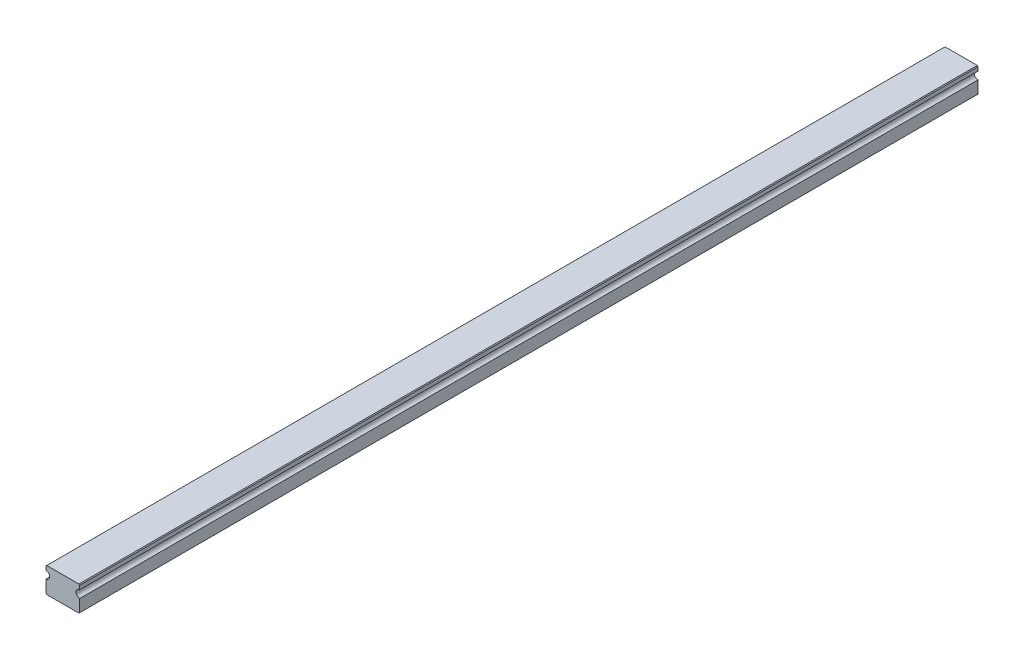
ISO-10303-21;
HEADER;
FILE_DESCRIPTION(('STEP AP214'),'2;1');
FILE_NAME('part.step','',(''),(''),'','','');
FILE_SCHEMA(('AUTOMOTIVE_DESIGN { 1 0 10303 214 1 1 1 1 }'));
ENDSEC;
DATA;
#1=APPLICATION_CONTEXT('core data for automotive mechanical design processes');
#2=APPLICATION_PROTOCOL_DEFINITION('international standard','automotive_design',2000,#1);
#3=PRODUCT_CONTEXT('',#1,'mechanical');
#4=PRODUCT('Part','Part','',(#3));
#5=PRODUCT_RELATED_PRODUCT_CATEGORY('part','',(#4));
#6=PRODUCT_DEFINITION_FORMATION('','',#4);
#7=PRODUCT_DEFINITION_CONTEXT('part definition',#1,'design');
#8=PRODUCT_DEFINITION('design','',#6,#7);
#9=PRODUCT_DEFINITION_SHAPE('','',#8);
#10=(LENGTH_UNIT() NAMED_UNIT(*) SI_UNIT(.MILLI.,.METRE.));
#11=(NAMED_UNIT(*) PLANE_ANGLE_UNIT() SI_UNIT($,.RADIAN.));
#12=(NAMED_UNIT(*) SI_UNIT($,.STERADIAN.) SOLID_ANGLE_UNIT());
#13=UNCERTAINTY_MEASURE_WITH_UNIT(LENGTH_MEASURE(1.E-05),#10,'distance_accuracy_value','');
#14=(GEOMETRIC_REPRESENTATION_CONTEXT(3) GLOBAL_UNCERTAINTY_ASSIGNED_CONTEXT((#13)) GLOBAL_UNIT_ASSIGNED_CONTEXT((#10,
#11,#12)) REPRESENTATION_CONTEXT('',''));
#15=CARTESIAN_POINT('',(0.,0.,0.));
#16=DIRECTION('',(0.,0.,1.));
#17=DIRECTION('',(1.,0.,0.));
#18=AXIS2_PLACEMENT_3D('',#15,#16,#17);
#19=CARTESIAN_POINT('',(-4.5,0.128302788979811,120.));
#20=DIRECTION('',(1.,0.,0.));
#21=DIRECTION('',(0.,0.,-1.));
#22=AXIS2_PLACEMENT_3D('',#19,#20,#21);
#23=PLANE('',#22);
#24=DIRECTION('',(0.,-1.,0.));
#25=VECTOR('',#24,1.);
#26=CARTESIAN_POINT('',(-4.5,0.128302788979811,-120.));
#27=LINE('',#26,#25);
#28=CARTESIAN_POINT('',(-4.5,0.128302788979811,-120.));
#29=VERTEX_POINT('',#28);
#30=CARTESIAN_POINT('',(-4.5,-3.17169721102019,-120.));
#31=VERTEX_POINT('',#30);
#32=EDGE_CURVE('E159',#29,#31,#27,.T.);
#33=ORIENTED_EDGE('',*,*,#32,.T.);
#34=DIRECTION('',(0.,0.,-1.));
#35=VECTOR('',#34,1.);
#36=CARTESIAN_POINT('',(-4.5,-3.17169721102019,120.));
#37=LINE('',#36,#35);
#38=CARTESIAN_POINT('',(-4.5,-3.17169721102019,120.));
#39=VERTEX_POINT('',#38);
#40=EDGE_CURVE('E43',#39,#31,#37,.T.);
#41=ORIENTED_EDGE('',*,*,#40,.F.);
#42=DIRECTION('',(0.,-1.,0.));
#43=VECTOR('',#42,1.);
#44=CARTESIAN_POINT('',(-4.5,0.128302788979811,120.));
#45=LINE('',#44,#43);
#46=CARTESIAN_POINT('',(-4.5,0.128302788979811,120.));
#47=VERTEX_POINT('',#46);
#48=EDGE_CURVE('E107',#47,#39,#45,.T.);
#49=ORIENTED_EDGE('',*,*,#48,.F.);
#50=DIRECTION('',(0.,0.,-1.));
#51=VECTOR('',#50,1.);
#52=CARTESIAN_POINT('',(-4.5,0.128302788979811,120.));
#53=LINE('',#52,#51);
#54=EDGE_CURVE('E11',#47,#29,#53,.T.);
#55=ORIENTED_EDGE('',*,*,#54,.T.);
#56=EDGE_LOOP('',(#33,#41,#49,#55));
#57=FACE_BOUND('',#56,.T.);
#58=ADVANCED_FACE('F35',(#57),#23,.F.);
#59=CARTESIAN_POINT('',(-4.5,-3.17169721102019,120.));
#60=DIRECTION('',(0.707106781186547,0.707106781186547,0.));
#61=DIRECTION('',(-0.707106781186548,0.707106781186548,0.));
#62=AXIS2_PLACEMENT_3D('',#59,#60,#61);
#63=PLANE('',#62);
#64=DIRECTION('',(0.707106781186547,-0.707106781186547,0.));
#65=VECTOR('',#64,1.);
#66=CARTESIAN_POINT('',(-4.5,-3.17169721102019,-120.));
#67=LINE('',#66,#65);
#68=CARTESIAN_POINT('',(-4.3,-3.37169721102019,-120.));
#69=VERTEX_POINT('',#68);
#70=EDGE_CURVE('E161',#31,#69,#67,.T.);
#71=ORIENTED_EDGE('',*,*,#70,.T.);
#72=DIRECTION('',(0.,0.,-1.));
#73=VECTOR('',#72,1.);
#74=CARTESIAN_POINT('',(-4.3,-3.37169721102019,120.));
#75=LINE('',#74,#73);
#76=CARTESIAN_POINT('',(-4.3,-3.37169721102019,120.));
#77=VERTEX_POINT('',#76);
#78=EDGE_CURVE('E199',#77,#69,#75,.T.);
#79=ORIENTED_EDGE('',*,*,#78,.F.);
#80=DIRECTION('',(0.707106781186547,-0.707106781186547,0.));
#81=VECTOR('',#80,1.);
#82=CARTESIAN_POINT('',(-4.5,-3.17169721102019,120.));
#83=LINE('',#82,#81);
#84=EDGE_CURVE('E207',#39,#77,#83,.T.);
#85=ORIENTED_EDGE('',*,*,#84,.F.);
#86=ORIENTED_EDGE('',*,*,#40,.T.);
#87=EDGE_LOOP('',(#71,#79,#85,#86));
#88=FACE_BOUND('',#87,.T.);
#89=ADVANCED_FACE('F205',(#88),#63,.F.);
#90=CARTESIAN_POINT('',(-4.3,-3.37169721102019,120.));
#91=DIRECTION('',(0.,1.,0.));
#92=DIRECTION('',(-1.,0.,0.));
#93=AXIS2_PLACEMENT_3D('',#90,#91,#92);
#94=PLANE('',#93);
#95=DIRECTION('',(1.,0.,0.));
#96=VECTOR('',#95,1.);
#97=CARTESIAN_POINT('',(-4.3,-3.37169721102019,-120.));
#98=LINE('',#97,#96);
#99=CARTESIAN_POINT('',(4.3,-3.37169721102019,-120.));
#100=VERTEX_POINT('',#99);
#101=EDGE_CURVE('E163',#69,#100,#98,.T.);
#102=ORIENTED_EDGE('',*,*,#101,.T.);
#103=DIRECTION('',(0.,0.,-1.));
#104=VECTOR('',#103,1.);
#105=CARTESIAN_POINT('',(4.3,-3.37169721102019,120.));
#106=LINE('',#105,#104);
#107=CARTESIAN_POINT('',(4.3,-3.37169721102019,120.));
#108=VERTEX_POINT('',#107);
#109=EDGE_CURVE('E196',#108,#100,#106,.T.);
#110=ORIENTED_EDGE('',*,*,#109,.F.);
#111=DIRECTION('',(1.,0.,0.));
#112=VECTOR('',#111,1.);
#113=CARTESIAN_POINT('',(-4.3,-3.37169721102019,120.));
#114=LINE('',#113,#112);
#115=EDGE_CURVE('E226',#77,#108,#114,.T.);
#116=ORIENTED_EDGE('',*,*,#115,.F.);
#117=ORIENTED_EDGE('',*,*,#78,.T.);
#118=EDGE_LOOP('',(#102,#110,#116,#117));
#119=FACE_BOUND('',#118,.T.);
#120=ADVANCED_FACE('F217',(#119),#94,.F.);
#121=CARTESIAN_POINT('',(4.3,-3.37169721102019,120.));
#122=DIRECTION('',(-0.707106781186547,0.707106781186547,0.));
#123=DIRECTION('',(-0.707106781186548,-0.707106781186548,0.));
#124=AXIS2_PLACEMENT_3D('',#121,#122,#123);
#125=PLANE('',#124);
#126=DIRECTION('',(0.707106781186547,0.707106781186547,0.));
#127=VECTOR('',#126,1.);
#128=CARTESIAN_POINT('',(4.3,-3.37169721102019,-120.));
#129=LINE('',#128,#127);
#130=CARTESIAN_POINT('',(4.5,-3.17169721102019,-120.));
#131=VERTEX_POINT('',#130);
#132=EDGE_CURVE('E165',#100,#131,#129,.T.);
#133=ORIENTED_EDGE('',*,*,#132,.T.);
#134=DIRECTION('',(0.,0.,-1.));
#135=VECTOR('',#134,1.);
#136=CARTESIAN_POINT('',(4.5,-3.17169721102019,120.));
#137=LINE('',#136,#135);
#138=CARTESIAN_POINT('',(4.5,-3.17169721102019,120.));
#139=VERTEX_POINT('',#138);
#140=EDGE_CURVE('E193',#139,#131,#137,.T.);
#141=ORIENTED_EDGE('',*,*,#140,.F.);
#142=DIRECTION('',(0.707106781186547,0.707106781186547,0.));
#143=VECTOR('',#142,1.);
#144=CARTESIAN_POINT('',(4.3,-3.37169721102019,120.));
#145=LINE('',#144,#143);
#146=EDGE_CURVE('E223',#108,#139,#145,.T.);
#147=ORIENTED_EDGE('',*,*,#146,.F.);
#148=ORIENTED_EDGE('',*,*,#109,.T.);
#149=EDGE_LOOP('',(#133,#141,#147,#148));
#150=FACE_BOUND('',#149,.T.);
#151=ADVANCED_FACE('F221',(#150),#125,.F.);
#152=CARTESIAN_POINT('',(4.5,-3.17169721102019,120.));
#153=DIRECTION('',(-1.,0.,0.));
#154=DIRECTION('',(0.,0.,1.));
#155=AXIS2_PLACEMENT_3D('',#152,#153,#154);
#156=PLANE('',#155);
#157=DIRECTION('',(0.,1.,0.));
#158=VECTOR('',#157,1.);
#159=CARTESIAN_POINT('',(4.5,-3.17169721102019,-120.));
#160=LINE('',#159,#158);
#161=CARTESIAN_POINT('',(4.5,0.128302788979812,-120.));
#162=VERTEX_POINT('',#161);
#163=EDGE_CURVE('E167',#131,#162,#160,.T.);
#164=ORIENTED_EDGE('',*,*,#163,.T.);
#165=DIRECTION('',(0.,0.,-1.));
#166=VECTOR('',#165,1.);
#167=CARTESIAN_POINT('',(4.5,0.128302788979812,120.));
#168=LINE('',#167,#166);
#169=CARTESIAN_POINT('',(4.5,0.128302788979812,120.));
#170=VERTEX_POINT('',#169);
#171=EDGE_CURVE('E190',#170,#162,#168,.T.);
#172=ORIENTED_EDGE('',*,*,#171,.F.);
#173=DIRECTION('',(0.,1.,0.));
#174=VECTOR('',#173,1.);
#175=CARTESIAN_POINT('',(4.5,-3.17169721102019,120.));
#176=LINE('',#175,#174);
#177=EDGE_CURVE('E225',#139,#170,#176,.T.);
#178=ORIENTED_EDGE('',*,*,#177,.F.);
#179=ORIENTED_EDGE('',*,*,#140,.T.);
#180=EDGE_LOOP('',(#164,#172,#178,#179));
#181=FACE_BOUND('',#180,.T.);
#182=ADVANCED_FACE('F268',(#181),#156,.F.);
#183=CARTESIAN_POINT('',(4.5,1.12830278897981,120.));
#184=DIRECTION('',(0.,0.,-1.));
#185=DIRECTION('',(-1.,0.,0.));
#186=AXIS2_PLACEMENT_3D('',#183,#184,#185);
#187=CYLINDRICAL_SURFACE('',#186,1.);
#188=CARTESIAN_POINT('',(4.5,1.12830278897981,-120.));
#189=DIRECTION('',(0.,0.,-1.));
#190=DIRECTION('',(1.,0.,0.));
#191=AXIS2_PLACEMENT_3D('',#188,#189,#190);
#192=CIRCLE('',#191,1.);
#193=CARTESIAN_POINT('',(4.5,2.12830278897981,-120.));
#194=VERTEX_POINT('',#193);
#195=EDGE_CURVE('E170',#162,#194,#192,.T.);
#196=ORIENTED_EDGE('',*,*,#195,.T.);
#197=DIRECTION('',(0.,0.,-1.));
#198=VECTOR('',#197,1.);
#199=CARTESIAN_POINT('',(4.5,2.12830278897981,120.));
#200=LINE('',#199,#198);
#201=CARTESIAN_POINT('',(4.5,2.12830278897981,120.));
#202=VERTEX_POINT('',#201);
#203=EDGE_CURVE('E187',#202,#194,#200,.T.);
#204=ORIENTED_EDGE('',*,*,#203,.F.);
#205=CARTESIAN_POINT('',(4.5,1.12830278897981,120.));
#206=DIRECTION('',(0.,0.,-1.));
#207=DIRECTION('',(1.,0.,0.));
#208=AXIS2_PLACEMENT_3D('',#205,#206,#207);
#209=CIRCLE('',#208,1.);
#210=EDGE_CURVE('E228',#170,#202,#209,.T.);
#211=ORIENTED_EDGE('',*,*,#210,.F.);
#212=ORIENTED_EDGE('',*,*,#171,.T.);
#213=EDGE_LOOP('',(#196,#204,#211,#212));
#214=FACE_BOUND('',#213,.T.);
#215=ADVANCED_FACE('F271',(#214),#187,.F.);
#216=CARTESIAN_POINT('',(4.5,2.12830278897981,120.));
#217=DIRECTION('',(-1.,0.,0.));
#218=DIRECTION('',(0.,0.,1.));
#219=AXIS2_PLACEMENT_3D('',#216,#217,#218);
#220=PLANE('',#219);
#221=DIRECTION('',(0.,1.,0.));
#222=VECTOR('',#221,1.);
#223=CARTESIAN_POINT('',(4.5,2.12830278897981,-120.));
#224=LINE('',#223,#222);
#225=CARTESIAN_POINT('',(4.5,3.17169721102019,-120.));
#226=VERTEX_POINT('',#225);
#227=EDGE_CURVE('E172',#194,#226,#224,.T.);
#228=ORIENTED_EDGE('',*,*,#227,.T.);
#229=DIRECTION('',(0.,0.,-1.));
#230=VECTOR('',#229,1.);
#231=CARTESIAN_POINT('',(4.5,3.17169721102019,120.));
#232=LINE('',#231,#230);
#233=CARTESIAN_POINT('',(4.5,3.17169721102019,120.));
#234=VERTEX_POINT('',#233);
#235=EDGE_CURVE('E184',#234,#226,#232,.T.);
#236=ORIENTED_EDGE('',*,*,#235,.F.);
#237=DIRECTION('',(0.,1.,0.));
#238=VECTOR('',#237,1.);
#239=CARTESIAN_POINT('',(4.5,2.12830278897981,120.));
#240=LINE('',#239,#238);
#241=EDGE_CURVE('E234',#202,#234,#240,.T.);
#242=ORIENTED_EDGE('',*,*,#241,.F.);
#243=ORIENTED_EDGE('',*,*,#203,.T.);
#244=EDGE_LOOP('',(#228,#236,#242,#243));
#245=FACE_BOUND('',#244,.T.);
#246=ADVANCED_FACE('F240',(#245),#220,.F.);
#247=CARTESIAN_POINT('',(4.5,3.17169721102019,120.));
#248=DIRECTION('',(-0.707106781186547,-0.707106781186547,0.));
#249=DIRECTION('',(0.707106781186548,-0.707106781186548,0.));
#250=AXIS2_PLACEMENT_3D('',#247,#248,#249);
#251=PLANE('',#250);
#252=DIRECTION('',(-0.707106781186547,0.707106781186547,0.));
#253=VECTOR('',#252,1.);
#254=CARTESIAN_POINT('',(4.5,3.17169721102019,-120.));
#255=LINE('',#254,#253);
#256=CARTESIAN_POINT('',(4.3,3.37169721102019,-120.));
#257=VERTEX_POINT('',#256);
#258=EDGE_CURVE('E174',#226,#257,#255,.T.);
#259=ORIENTED_EDGE('',*,*,#258,.T.);
#260=DIRECTION('',(0.,0.,-1.));
#261=VECTOR('',#260,1.);
#262=CARTESIAN_POINT('',(4.3,3.37169721102019,120.));
#263=LINE('',#262,#261);
#264=CARTESIAN_POINT('',(4.3,3.37169721102019,120.));
#265=VERTEX_POINT('',#264);
#266=EDGE_CURVE('E148',#265,#257,#263,.T.);
#267=ORIENTED_EDGE('',*,*,#266,.F.);
#268=DIRECTION('',(-0.707106781186547,0.707106781186547,0.));
#269=VECTOR('',#268,1.);
#270=CARTESIAN_POINT('',(4.5,3.17169721102019,120.));
#271=LINE('',#270,#269);
#272=EDGE_CURVE('E139',#234,#265,#271,.T.);
#273=ORIENTED_EDGE('',*,*,#272,.F.);
#274=ORIENTED_EDGE('',*,*,#235,.T.);
#275=EDGE_LOOP('',(#259,#267,#273,#274));
#276=FACE_BOUND('',#275,.T.);
#277=ADVANCED_FACE('F244',(#276),#251,.F.);
#278=CARTESIAN_POINT('',(4.3,3.37169721102019,120.));
#279=DIRECTION('',(0.,-1.,0.));
#280=DIRECTION('',(1.,0.,0.));
#281=AXIS2_PLACEMENT_3D('',#278,#279,#280);
#282=PLANE('',#281);
#283=DIRECTION('',(-1.,0.,0.));
#284=VECTOR('',#283,1.);
#285=CARTESIAN_POINT('',(4.3,3.37169721102019,-120.));
#286=LINE('',#285,#284);
#287=CARTESIAN_POINT('',(-4.3,3.37169721102019,-120.));
#288=VERTEX_POINT('',#287);
#289=EDGE_CURVE('E147',#257,#288,#286,.T.);
#290=ORIENTED_EDGE('',*,*,#289,.T.);
#291=DIRECTION('',(0.,0.,-1.));
#292=VECTOR('',#291,1.);
#293=CARTESIAN_POINT('',(-4.3,3.37169721102019,120.));
#294=LINE('',#293,#292);
#295=CARTESIAN_POINT('',(-4.3,3.37169721102019,120.));
#296=VERTEX_POINT('',#295);
#297=EDGE_CURVE('E144',#296,#288,#294,.T.);
#298=ORIENTED_EDGE('',*,*,#297,.F.);
#299=DIRECTION('',(-1.,0.,0.));
#300=VECTOR('',#299,1.);
#301=CARTESIAN_POINT('',(4.3,3.37169721102019,120.));
#302=LINE('',#301,#300);
#303=EDGE_CURVE('E133',#265,#296,#302,.T.);
#304=ORIENTED_EDGE('',*,*,#303,.F.);
#305=ORIENTED_EDGE('',*,*,#266,.T.);
#306=EDGE_LOOP('',(#290,#298,#304,#305));
#307=FACE_BOUND('',#306,.T.);
#308=ADVANCED_FACE('F145',(#307),#282,.F.);
#309=CARTESIAN_POINT('',(-4.3,3.37169721102019,120.));
#310=DIRECTION('',(0.707106781186547,-0.707106781186547,0.));
#311=DIRECTION('',(0.707106781186548,0.707106781186548,0.));
#312=AXIS2_PLACEMENT_3D('',#309,#310,#311);
#313=PLANE('',#312);
#314=DIRECTION('',(-0.707106781186547,-0.707106781186547,0.));
#315=VECTOR('',#314,1.);
#316=CARTESIAN_POINT('',(-4.3,3.37169721102019,-120.));
#317=LINE('',#316,#315);
#318=CARTESIAN_POINT('',(-4.5,3.17169721102019,-120.));
#319=VERTEX_POINT('',#318);
#320=EDGE_CURVE('E93',#288,#319,#317,.T.);
#321=ORIENTED_EDGE('',*,*,#320,.T.);
#322=DIRECTION('',(0.,0.,-1.));
#323=VECTOR('',#322,1.);
#324=CARTESIAN_POINT('',(-4.5,3.17169721102019,120.));
#325=LINE('',#324,#323);
#326=CARTESIAN_POINT('',(-4.5,3.17169721102019,120.));
#327=VERTEX_POINT('',#326);
#328=EDGE_CURVE('E149',#327,#319,#325,.T.);
#329=ORIENTED_EDGE('',*,*,#328,.F.);
#330=DIRECTION('',(-0.707106781186547,-0.707106781186547,0.));
#331=VECTOR('',#330,1.);
#332=CARTESIAN_POINT('',(-4.3,3.37169721102019,120.));
#333=LINE('',#332,#331);
#334=EDGE_CURVE('E137',#296,#327,#333,.T.);
#335=ORIENTED_EDGE('',*,*,#334,.F.);
#336=ORIENTED_EDGE('',*,*,#297,.T.);
#337=EDGE_LOOP('',(#321,#329,#335,#336));
#338=FACE_BOUND('',#337,.T.);
#339=ADVANCED_FACE('F151',(#338),#313,.F.);
#340=CARTESIAN_POINT('',(-4.5,3.17169721102019,120.));
#341=DIRECTION('',(1.,0.,0.));
#342=DIRECTION('',(0.,0.,-1.));
#343=AXIS2_PLACEMENT_3D('',#340,#341,#342);
#344=PLANE('',#343);
#345=DIRECTION('',(0.,-1.,0.));
#346=VECTOR('',#345,1.);
#347=CARTESIAN_POINT('',(-4.5,3.17169721102019,-120.));
#348=LINE('',#347,#346);
#349=CARTESIAN_POINT('',(-4.5,2.12830278897981,-120.));
#350=VERTEX_POINT('',#349);
#351=EDGE_CURVE('E100',#319,#350,#348,.T.);
#352=ORIENTED_EDGE('',*,*,#351,.T.);
#353=DIRECTION('',(0.,0.,-1.));
#354=VECTOR('',#353,1.);
#355=CARTESIAN_POINT('',(-4.5,2.12830278897981,120.));
#356=LINE('',#355,#354);
#357=CARTESIAN_POINT('',(-4.5,2.12830278897981,120.));
#358=VERTEX_POINT('',#357);
#359=EDGE_CURVE('E155',#358,#350,#356,.T.);
#360=ORIENTED_EDGE('',*,*,#359,.F.);
#361=DIRECTION('',(0.,-1.,0.));
#362=VECTOR('',#361,1.);
#363=CARTESIAN_POINT('',(-4.5,3.17169721102019,120.));
#364=LINE('',#363,#362);
#365=EDGE_CURVE('E153',#327,#358,#364,.T.);
#366=ORIENTED_EDGE('',*,*,#365,.F.);
#367=ORIENTED_EDGE('',*,*,#328,.T.);
#368=EDGE_LOOP('',(#352,#360,#366,#367));
#369=FACE_BOUND('',#368,.T.);
#370=ADVANCED_FACE('F246',(#369),#344,.F.);
#371=CARTESIAN_POINT('',(-4.5,1.12830278897981,120.));
#372=DIRECTION('',(0.,0.,-1.));
#373=DIRECTION('',(-1.,0.,0.));
#374=AXIS2_PLACEMENT_3D('',#371,#372,#373);
#375=CYLINDRICAL_SURFACE('',#374,1.);
#376=CARTESIAN_POINT('',(-4.5,1.12830278897981,-120.));
#377=DIRECTION('',(0.,0.,-1.));
#378=DIRECTION('',(1.,0.,0.));
#379=AXIS2_PLACEMENT_3D('',#376,#377,#378);
#380=CIRCLE('',#379,1.);
#381=EDGE_CURVE('E179',#350,#29,#380,.T.);
#382=ORIENTED_EDGE('',*,*,#381,.T.);
#383=ORIENTED_EDGE('',*,*,#54,.F.);
#384=CARTESIAN_POINT('',(-4.5,1.12830278897981,120.));
#385=DIRECTION('',(0.,0.,-1.));
#386=DIRECTION('',(1.,0.,0.));
#387=AXIS2_PLACEMENT_3D('',#384,#385,#386);
#388=CIRCLE('',#387,1.);
#389=EDGE_CURVE('E51',#358,#47,#388,.T.);
#390=ORIENTED_EDGE('',*,*,#389,.F.);
#391=ORIENTED_EDGE('',*,*,#359,.T.);
#392=EDGE_LOOP('',(#382,#383,#390,#391));
#393=FACE_BOUND('',#392,.T.);
#394=ADVANCED_FACE('F245',(#393),#375,.F.);
#395=CARTESIAN_POINT('',(-4.5,1.12830278897981,120.));
#396=DIRECTION('',(0.,0.,1.));
#397=DIRECTION('',(1.,0.,0.));
#398=AXIS2_PLACEMENT_3D('',#395,#396,#397);
#399=PLANE('',#398);
#400=ORIENTED_EDGE('',*,*,#389,.T.);
#401=ORIENTED_EDGE('',*,*,#48,.T.);
#402=ORIENTED_EDGE('',*,*,#84,.T.);
#403=ORIENTED_EDGE('',*,*,#115,.T.);
#404=ORIENTED_EDGE('',*,*,#146,.T.);
#405=ORIENTED_EDGE('',*,*,#177,.T.);
#406=ORIENTED_EDGE('',*,*,#210,.T.);
#407=ORIENTED_EDGE('',*,*,#241,.T.);
#408=ORIENTED_EDGE('',*,*,#272,.T.);
#409=ORIENTED_EDGE('',*,*,#303,.T.);
#410=ORIENTED_EDGE('',*,*,#334,.T.);
#411=ORIENTED_EDGE('',*,*,#365,.T.);
#412=EDGE_LOOP('',(#400,#401,#402,#403,#404,#405,#406,#407,#408,#409,#410,#411));
#413=FACE_BOUND('',#412,.T.);
#414=ADVANCED_FACE('F135',(#413),#399,.T.);
#415=CARTESIAN_POINT('',(-4.5,1.12830278897981,-120.));
#416=DIRECTION('',(0.,0.,1.));
#417=DIRECTION('',(1.,0.,0.));
#418=AXIS2_PLACEMENT_3D('',#415,#416,#417);
#419=PLANE('',#418);
#420=ORIENTED_EDGE('',*,*,#32,.F.);
#421=ORIENTED_EDGE('',*,*,#381,.F.);
#422=ORIENTED_EDGE('',*,*,#351,.F.);
#423=ORIENTED_EDGE('',*,*,#320,.F.);
#424=ORIENTED_EDGE('',*,*,#289,.F.);
#425=ORIENTED_EDGE('',*,*,#258,.F.);
#426=ORIENTED_EDGE('',*,*,#227,.F.);
#427=ORIENTED_EDGE('',*,*,#195,.F.);
#428=ORIENTED_EDGE('',*,*,#163,.F.);
#429=ORIENTED_EDGE('',*,*,#132,.F.);
#430=ORIENTED_EDGE('',*,*,#101,.F.);
#431=ORIENTED_EDGE('',*,*,#70,.F.);
#432=EDGE_LOOP('',(#420,#421,#422,#423,#424,#425,#426,#427,#428,#429,#430,#431));
#433=FACE_BOUND('',#432,.T.);
#434=ADVANCED_FACE('F211',(#433),#419,.F.);
#435=CLOSED_SHELL('',(#58,#89,#120,#151,#182,#215,#246,#277,#308,#339,#370,#394,#414,#434));
#436=MANIFOLD_SOLID_BREP('B2',#435);
#437=ADVANCED_BREP_SHAPE_REPRESENTATION('',(#18,#436),#14);
#438=SHAPE_DEFINITION_REPRESENTATION(#9,#437);
ENDSEC;
END-ISO-10303-21;
